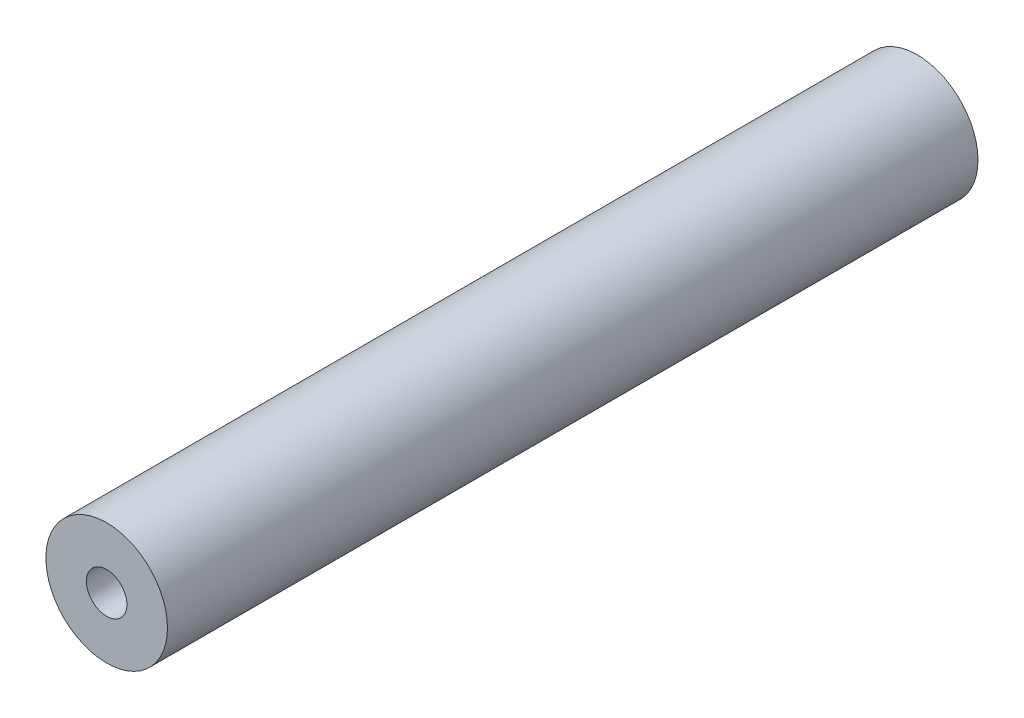
ISO-10303-21;
HEADER;
FILE_DESCRIPTION(('STEP AP214'),'2;1');
FILE_NAME('part.step','',(''),(''),'','','');
FILE_SCHEMA(('AUTOMOTIVE_DESIGN { 1 0 10303 214 1 1 1 1 }'));
ENDSEC;
DATA;
#1=APPLICATION_CONTEXT('core data for automotive mechanical design processes');
#2=APPLICATION_PROTOCOL_DEFINITION('international standard','automotive_design',2000,#1);
#3=PRODUCT_CONTEXT('',#1,'mechanical');
#4=PRODUCT('Part','Part','',(#3));
#5=PRODUCT_RELATED_PRODUCT_CATEGORY('part','',(#4));
#6=PRODUCT_DEFINITION_FORMATION('','',#4);
#7=PRODUCT_DEFINITION_CONTEXT('part definition',#1,'design');
#8=PRODUCT_DEFINITION('design','',#6,#7);
#9=PRODUCT_DEFINITION_SHAPE('','',#8);
#10=(LENGTH_UNIT() NAMED_UNIT(*) SI_UNIT(.MILLI.,.METRE.));
#11=(NAMED_UNIT(*) PLANE_ANGLE_UNIT() SI_UNIT($,.RADIAN.));
#12=(NAMED_UNIT(*) SI_UNIT($,.STERADIAN.) SOLID_ANGLE_UNIT());
#13=UNCERTAINTY_MEASURE_WITH_UNIT(LENGTH_MEASURE(1.E-05),#10,'distance_accuracy_value','');
#14=(GEOMETRIC_REPRESENTATION_CONTEXT(3) GLOBAL_UNCERTAINTY_ASSIGNED_CONTEXT((#13)) GLOBAL_UNIT_ASSIGNED_CONTEXT((#10,
#11,#12)) REPRESENTATION_CONTEXT('',''));
#15=CARTESIAN_POINT('',(0.,0.,0.));
#16=DIRECTION('',(0.,0.,1.));
#17=DIRECTION('',(1.,0.,0.));
#18=AXIS2_PLACEMENT_3D('',#15,#16,#17);
#19=CARTESIAN_POINT('',(0.,0.,63.5));
#20=DIRECTION('',(0.,0.,1.));
#21=DIRECTION('',(1.,0.,0.));
#22=AXIS2_PLACEMENT_3D('',#19,#20,#21);
#23=PLANE('',#22);
#24=CARTESIAN_POINT('',(0.,0.,63.5));
#25=DIRECTION('',(0.,0.,1.));
#26=DIRECTION('',(1.,0.,0.));
#27=AXIS2_PLACEMENT_3D('',#24,#25,#26);
#28=CIRCLE('',#27,4.7625);
#29=CARTESIAN_POINT('',(4.7625,0.,63.5));
#30=VERTEX_POINT('',#29);
#31=EDGE_CURVE('E11',#30,#30,#28,.T.);
#32=ORIENTED_EDGE('',*,*,#31,.T.);
#33=EDGE_LOOP('',(#32));
#34=FACE_BOUND('',#33,.T.);
#35=CARTESIAN_POINT('',(0.,0.,63.5));
#36=DIRECTION('',(0.,0.,1.));
#37=DIRECTION('',(1.,0.,0.));
#38=AXIS2_PLACEMENT_3D('',#35,#36,#37);
#39=CIRCLE('',#38,1.5875);
#40=CARTESIAN_POINT('',(1.5875,0.,63.5));
#41=VERTEX_POINT('',#40);
#42=EDGE_CURVE('E47',#41,#41,#39,.T.);
#43=ORIENTED_EDGE('',*,*,#42,.F.);
#44=EDGE_LOOP('',(#43));
#45=FACE_BOUND('',#44,.T.);
#46=ADVANCED_FACE('F36',(#34,#45),#23,.T.);
#47=CARTESIAN_POINT('',(0.,0.,0.));
#48=DIRECTION('',(0.,0.,1.));
#49=DIRECTION('',(1.,0.,0.));
#50=AXIS2_PLACEMENT_3D('',#47,#48,#49);
#51=PLANE('',#50);
#52=CARTESIAN_POINT('',(0.,0.,0.));
#53=DIRECTION('',(0.,0.,1.));
#54=DIRECTION('',(1.,0.,0.));
#55=AXIS2_PLACEMENT_3D('',#52,#53,#54);
#56=CIRCLE('',#55,4.7625);
#57=CARTESIAN_POINT('',(4.7625,0.,0.));
#58=VERTEX_POINT('',#57);
#59=EDGE_CURVE('E40',#58,#58,#56,.T.);
#60=ORIENTED_EDGE('',*,*,#59,.F.);
#61=EDGE_LOOP('',(#60));
#62=FACE_BOUND('',#61,.T.);
#63=CARTESIAN_POINT('',(0.,0.,0.));
#64=DIRECTION('',(0.,0.,1.));
#65=DIRECTION('',(1.,0.,0.));
#66=AXIS2_PLACEMENT_3D('',#63,#64,#65);
#67=CIRCLE('',#66,1.5875);
#68=CARTESIAN_POINT('',(1.5875,0.,0.));
#69=VERTEX_POINT('',#68);
#70=EDGE_CURVE('E49',#69,#69,#67,.T.);
#71=ORIENTED_EDGE('',*,*,#70,.T.);
#72=EDGE_LOOP('',(#71));
#73=FACE_BOUND('',#72,.T.);
#74=ADVANCED_FACE('F59',(#62,#73),#51,.F.);
#75=CARTESIAN_POINT('',(0.,0.,63.5));
#76=DIRECTION('',(0.,0.,-1.));
#77=DIRECTION('',(-1.,0.,0.));
#78=AXIS2_PLACEMENT_3D('',#75,#76,#77);
#79=CYLINDRICAL_SURFACE('',#78,4.7625);
#80=ORIENTED_EDGE('',*,*,#31,.F.);
#81=EDGE_LOOP('',(#80));
#82=FACE_BOUND('',#81,.T.);
#83=ORIENTED_EDGE('',*,*,#59,.T.);
#84=EDGE_LOOP('',(#83));
#85=FACE_BOUND('',#84,.T.);
#86=ADVANCED_FACE('F38',(#82,#85),#79,.T.);
#87=CARTESIAN_POINT('',(0.,0.,63.5));
#88=DIRECTION('',(0.,0.,-1.));
#89=DIRECTION('',(-1.,0.,0.));
#90=AXIS2_PLACEMENT_3D('',#87,#88,#89);
#91=CYLINDRICAL_SURFACE('',#90,1.5875);
#92=ORIENTED_EDGE('',*,*,#42,.T.);
#93=EDGE_LOOP('',(#92));
#94=FACE_BOUND('',#93,.T.);
#95=ORIENTED_EDGE('',*,*,#70,.F.);
#96=EDGE_LOOP('',(#95));
#97=FACE_BOUND('',#96,.T.);
#98=ADVANCED_FACE('F55',(#94,#97),#91,.F.);
#99=CLOSED_SHELL('',(#46,#74,#86,#98));
#100=MANIFOLD_SOLID_BREP('B2',#99);
#101=ADVANCED_BREP_SHAPE_REPRESENTATION('',(#18,#100),#14);
#102=SHAPE_DEFINITION_REPRESENTATION(#9,#101);
ENDSEC;
END-ISO-10303-21;
